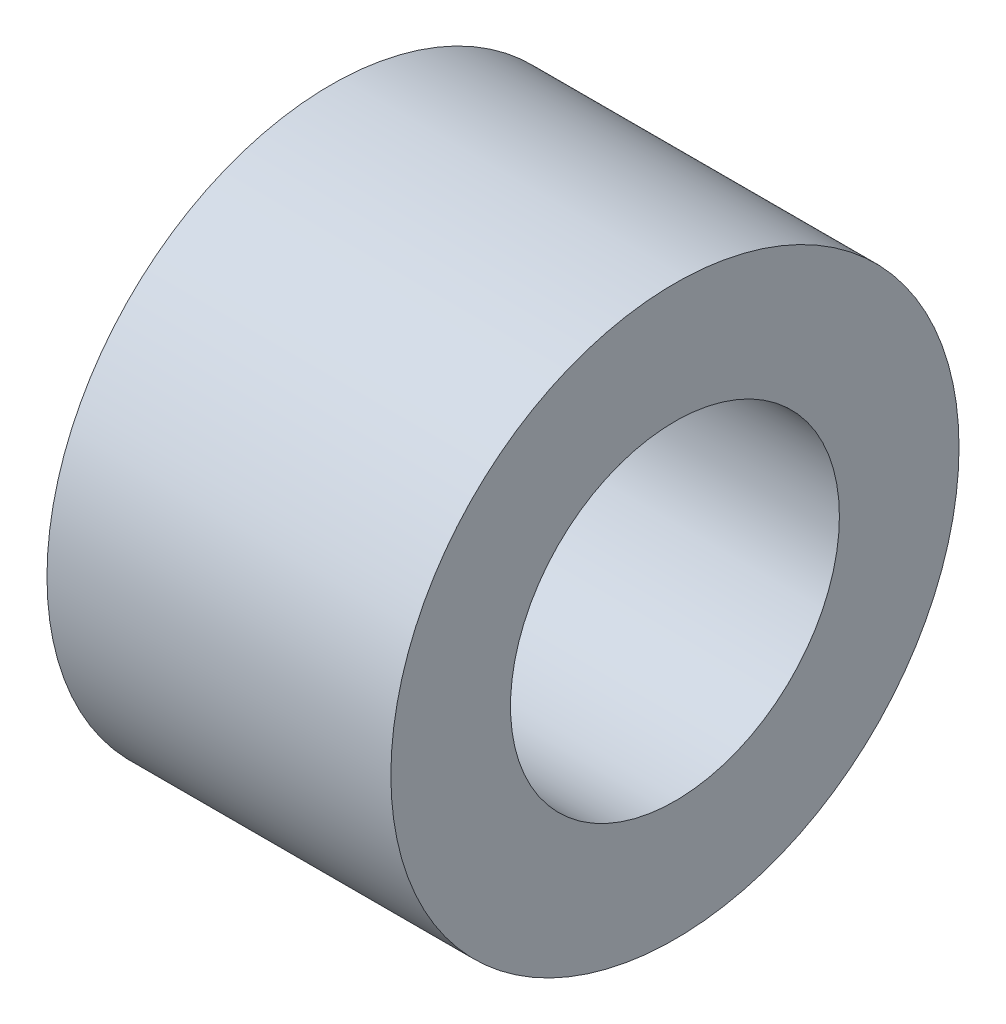
ISO-10303-21;
HEADER;
FILE_DESCRIPTION(('STEP AP214'),'2;1');
FILE_NAME('part.step','',(''),(''),'','','');
FILE_SCHEMA(('AUTOMOTIVE_DESIGN { 1 0 10303 214 1 1 1 1 }'));
ENDSEC;
DATA;
#1=APPLICATION_CONTEXT('core data for automotive mechanical design processes');
#2=APPLICATION_PROTOCOL_DEFINITION('international standard','automotive_design',2000,#1);
#3=PRODUCT_CONTEXT('',#1,'mechanical');
#4=PRODUCT('Part','Part','',(#3));
#5=PRODUCT_RELATED_PRODUCT_CATEGORY('part','',(#4));
#6=PRODUCT_DEFINITION_FORMATION('','',#4);
#7=PRODUCT_DEFINITION_CONTEXT('part definition',#1,'design');
#8=PRODUCT_DEFINITION('design','',#6,#7);
#9=PRODUCT_DEFINITION_SHAPE('','',#8);
#10=(LENGTH_UNIT() NAMED_UNIT(*) SI_UNIT(.MILLI.,.METRE.));
#11=(NAMED_UNIT(*) PLANE_ANGLE_UNIT() SI_UNIT($,.RADIAN.));
#12=(NAMED_UNIT(*) SI_UNIT($,.STERADIAN.) SOLID_ANGLE_UNIT());
#13=UNCERTAINTY_MEASURE_WITH_UNIT(LENGTH_MEASURE(1.E-05),#10,'distance_accuracy_value','');
#14=(GEOMETRIC_REPRESENTATION_CONTEXT(3) GLOBAL_UNCERTAINTY_ASSIGNED_CONTEXT((#13)) GLOBAL_UNIT_ASSIGNED_CONTEXT((#10,
#11,#12)) REPRESENTATION_CONTEXT('',''));
#15=CARTESIAN_POINT('',(0.,0.,0.));
#16=DIRECTION('',(0.,0.,1.));
#17=DIRECTION('',(1.,0.,0.));
#18=AXIS2_PLACEMENT_3D('',#15,#16,#17);
#19=CARTESIAN_POINT('',(5.75,0.,0.));
#20=DIRECTION('',(1.,0.,0.));
#21=DIRECTION('',(0.,0.,-1.));
#22=AXIS2_PLACEMENT_3D('',#19,#20,#21);
#23=PLANE('',#22);
#24=CARTESIAN_POINT('',(5.75,0.,0.));
#25=DIRECTION('',(1.,0.,0.));
#26=DIRECTION('',(0.,0.,-1.));
#27=AXIS2_PLACEMENT_3D('',#24,#25,#26);
#28=CIRCLE('',#27,4.75);
#29=CARTESIAN_POINT('',(5.75,0.,-4.75));
#30=VERTEX_POINT('',#29);
#31=EDGE_CURVE('E10',#30,#30,#28,.T.);
#32=ORIENTED_EDGE('',*,*,#31,.T.);
#33=EDGE_LOOP('',(#32));
#34=FACE_BOUND('',#33,.T.);
#35=CARTESIAN_POINT('',(5.75,0.,0.));
#36=DIRECTION('',(1.,0.,0.));
#37=DIRECTION('',(0.,0.,-1.));
#38=AXIS2_PLACEMENT_3D('',#35,#36,#37);
#39=CIRCLE('',#38,2.75);
#40=CARTESIAN_POINT('',(5.75,0.,-2.75));
#41=VERTEX_POINT('',#40);
#42=EDGE_CURVE('E42',#41,#41,#39,.T.);
#43=ORIENTED_EDGE('',*,*,#42,.F.);
#44=EDGE_LOOP('',(#43));
#45=FACE_BOUND('',#44,.T.);
#46=ADVANCED_FACE('F31',(#34,#45),#23,.T.);
#47=CARTESIAN_POINT('',(0.,0.,0.));
#48=DIRECTION('',(1.,0.,0.));
#49=DIRECTION('',(0.,0.,-1.));
#50=AXIS2_PLACEMENT_3D('',#47,#48,#49);
#51=PLANE('',#50);
#52=CARTESIAN_POINT('',(0.,0.,0.));
#53=DIRECTION('',(1.,0.,0.));
#54=DIRECTION('',(0.,0.,-1.));
#55=AXIS2_PLACEMENT_3D('',#52,#53,#54);
#56=CIRCLE('',#55,4.75);
#57=CARTESIAN_POINT('',(0.,0.,-4.75));
#58=VERTEX_POINT('',#57);
#59=EDGE_CURVE('E35',#58,#58,#56,.T.);
#60=ORIENTED_EDGE('',*,*,#59,.F.);
#61=EDGE_LOOP('',(#60));
#62=FACE_BOUND('',#61,.T.);
#63=CARTESIAN_POINT('',(0.,0.,0.));
#64=DIRECTION('',(1.,0.,0.));
#65=DIRECTION('',(0.,0.,-1.));
#66=AXIS2_PLACEMENT_3D('',#63,#64,#65);
#67=CIRCLE('',#66,2.75);
#68=CARTESIAN_POINT('',(0.,0.,-2.75));
#69=VERTEX_POINT('',#68);
#70=EDGE_CURVE('E44',#69,#69,#67,.T.);
#71=ORIENTED_EDGE('',*,*,#70,.T.);
#72=EDGE_LOOP('',(#71));
#73=FACE_BOUND('',#72,.T.);
#74=ADVANCED_FACE('F54',(#62,#73),#51,.F.);
#75=CARTESIAN_POINT('',(5.75,0.,0.));
#76=DIRECTION('',(-1.,0.,0.));
#77=DIRECTION('',(0.,0.,1.));
#78=AXIS2_PLACEMENT_3D('',#75,#76,#77);
#79=CYLINDRICAL_SURFACE('',#78,4.75);
#80=ORIENTED_EDGE('',*,*,#31,.F.);
#81=EDGE_LOOP('',(#80));
#82=FACE_BOUND('',#81,.T.);
#83=ORIENTED_EDGE('',*,*,#59,.T.);
#84=EDGE_LOOP('',(#83));
#85=FACE_BOUND('',#84,.T.);
#86=ADVANCED_FACE('F33',(#82,#85),#79,.T.);
#87=CARTESIAN_POINT('',(5.75,0.,0.));
#88=DIRECTION('',(-1.,0.,0.));
#89=DIRECTION('',(0.,0.,1.));
#90=AXIS2_PLACEMENT_3D('',#87,#88,#89);
#91=CYLINDRICAL_SURFACE('',#90,2.75);
#92=ORIENTED_EDGE('',*,*,#42,.T.);
#93=EDGE_LOOP('',(#92));
#94=FACE_BOUND('',#93,.T.);
#95=ORIENTED_EDGE('',*,*,#70,.F.);
#96=EDGE_LOOP('',(#95));
#97=FACE_BOUND('',#96,.T.);
#98=ADVANCED_FACE('F50',(#94,#97),#91,.F.);
#99=CLOSED_SHELL('',(#46,#74,#86,#98));
#100=MANIFOLD_SOLID_BREP('B2',#99);
#101=ADVANCED_BREP_SHAPE_REPRESENTATION('',(#18,#100),#14);
#102=SHAPE_DEFINITION_REPRESENTATION(#9,#101);
ENDSEC;
END-ISO-10303-21;
